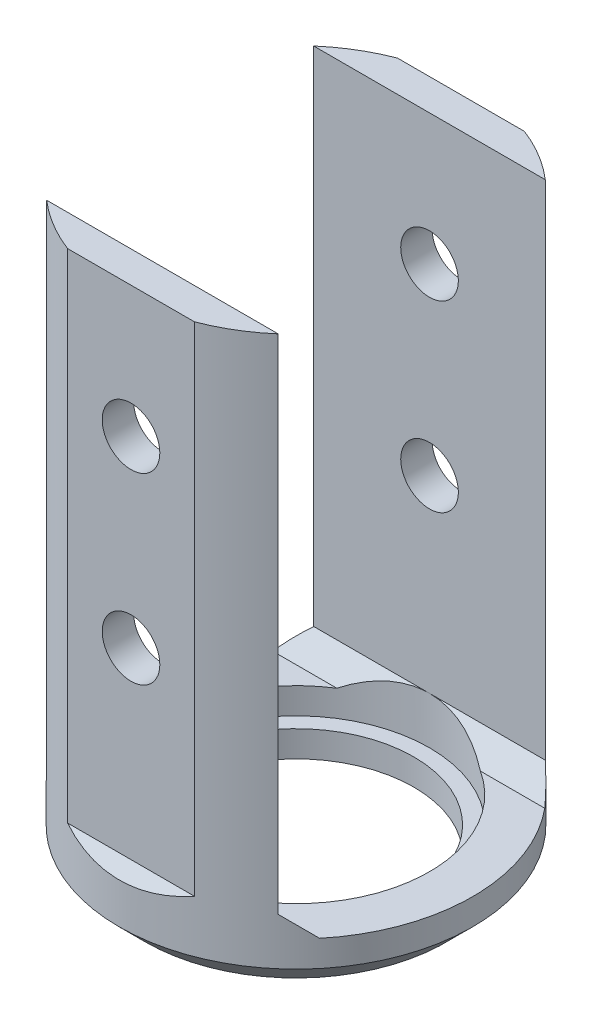
ISO-10303-21;
HEADER;
FILE_DESCRIPTION(('STEP AP214'),'2;1');
FILE_NAME('part.step','',(''),(''),'','','');
FILE_SCHEMA(('AUTOMOTIVE_DESIGN { 1 0 10303 214 1 1 1 1 }'));
ENDSEC;
DATA;
#1=APPLICATION_CONTEXT('core data for automotive mechanical design processes');
#2=APPLICATION_PROTOCOL_DEFINITION('international standard','automotive_design',2000,#1);
#3=PRODUCT_CONTEXT('',#1,'mechanical');
#4=PRODUCT('Part','Part','',(#3));
#5=PRODUCT_RELATED_PRODUCT_CATEGORY('part','',(#4));
#6=PRODUCT_DEFINITION_FORMATION('','',#4);
#7=PRODUCT_DEFINITION_CONTEXT('part definition',#1,'design');
#8=PRODUCT_DEFINITION('design','',#6,#7);
#9=PRODUCT_DEFINITION_SHAPE('','',#8);
#10=(LENGTH_UNIT() NAMED_UNIT(*) SI_UNIT(.MILLI.,.METRE.));
#11=(NAMED_UNIT(*) PLANE_ANGLE_UNIT() SI_UNIT($,.RADIAN.));
#12=(NAMED_UNIT(*) SI_UNIT($,.STERADIAN.) SOLID_ANGLE_UNIT());
#13=UNCERTAINTY_MEASURE_WITH_UNIT(LENGTH_MEASURE(1.E-05),#10,'distance_accuracy_value','');
#14=(GEOMETRIC_REPRESENTATION_CONTEXT(3) GLOBAL_UNCERTAINTY_ASSIGNED_CONTEXT((#13)) GLOBAL_UNIT_ASSIGNED_CONTEXT((#10,
#11,#12)) REPRESENTATION_CONTEXT('',''));
#15=CARTESIAN_POINT('',(0.,0.,0.));
#16=DIRECTION('',(0.,0.,1.));
#17=DIRECTION('',(1.,0.,0.));
#18=AXIS2_PLACEMENT_3D('',#15,#16,#17);
#19=CARTESIAN_POINT('',(0.,2.,0.));
#20=DIRECTION('',(0.,1.,0.));
#21=DIRECTION('',(0.,0.,1.));
#22=AXIS2_PLACEMENT_3D('',#19,#20,#21);
#23=PLANE('',#22);
#24=CARTESIAN_POINT('',(0.,2.,0.));
#25=DIRECTION('',(0.,1.,0.));
#26=DIRECTION('',(0.,0.,1.));
#27=AXIS2_PLACEMENT_3D('',#24,#25,#26);
#28=CIRCLE('',#27,5.1);
#29=CARTESIAN_POINT('',(2.74226184016044,2.,4.29999999999999));
#30=VERTEX_POINT('',#29);
#31=CARTESIAN_POINT('',(2.74226184016043,2.,-4.29999999999999));
#32=VERTEX_POINT('',#31);
#33=EDGE_CURVE('E190',#30,#32,#28,.T.);
#34=ORIENTED_EDGE('',*,*,#33,.F.);
#35=DIRECTION('',(1.,0.,0.));
#36=VECTOR('',#35,1.);
#37=CARTESIAN_POINT('',(4.4218208918951,2.,4.29999999999999));
#38=LINE('',#37,#36);
#39=CARTESIAN_POINT('',(5.20312406156149,2.,4.29999999999999));
#40=VERTEX_POINT('',#39);
#41=EDGE_CURVE('E232',#30,#40,#38,.T.);
#42=ORIENTED_EDGE('',*,*,#41,.T.);
#43=CARTESIAN_POINT('',(0.,2.,0.));
#44=DIRECTION('',(0.,1.,0.));
#45=DIRECTION('',(0.,0.,1.));
#46=AXIS2_PLACEMENT_3D('',#43,#44,#45);
#47=CIRCLE('',#46,6.75);
#48=CARTESIAN_POINT('',(5.20312406156148,2.,-4.29999999999999));
#49=VERTEX_POINT('',#48);
#50=EDGE_CURVE('E200',#40,#49,#47,.T.);
#51=ORIENTED_EDGE('',*,*,#50,.T.);
#52=DIRECTION('',(-1.,0.,0.));
#53=VECTOR('',#52,1.);
#54=CARTESIAN_POINT('',(0.,2.,-4.29999999999999));
#55=LINE('',#54,#53);
#56=EDGE_CURVE('E230',#49,#32,#55,.T.);
#57=ORIENTED_EDGE('',*,*,#56,.T.);
#58=EDGE_LOOP('',(#34,#42,#51,#57));
#59=FACE_BOUND('',#58,.T.);
#60=ADVANCED_FACE('F45',(#59),#23,.T.);
#61=CARTESIAN_POINT('',(0.,2.,0.));
#62=DIRECTION('',(0.,-1.,0.));
#63=DIRECTION('',(0.,0.,-1.));
#64=AXIS2_PLACEMENT_3D('',#61,#62,#63);
#65=CYLINDRICAL_SURFACE('',#64,4.5);
#66=CARTESIAN_POINT('',(0.,0.,0.));
#67=DIRECTION('',(0.,1.,0.));
#68=DIRECTION('',(0.,0.,1.));
#69=AXIS2_PLACEMENT_3D('',#66,#67,#68);
#70=CIRCLE('',#69,4.5);
#71=CARTESIAN_POINT('',(0.,0.,4.5));
#72=VERTEX_POINT('',#71);
#73=EDGE_CURVE('E197',#72,#72,#70,.T.);
#74=ORIENTED_EDGE('',*,*,#73,.F.);
#75=EDGE_LOOP('',(#74));
#76=FACE_BOUND('',#75,.T.);
#77=CARTESIAN_POINT('',(0.,1.,0.));
#78=DIRECTION('',(0.,1.,0.));
#79=DIRECTION('',(0.,0.,1.));
#80=AXIS2_PLACEMENT_3D('',#77,#78,#79);
#81=CIRCLE('',#80,4.5);
#82=CARTESIAN_POINT('',(0.,1.,4.5));
#83=VERTEX_POINT('',#82);
#84=EDGE_CURVE('E194',#83,#83,#81,.T.);
#85=ORIENTED_EDGE('',*,*,#84,.T.);
#86=EDGE_LOOP('',(#85));
#87=FACE_BOUND('',#86,.T.);
#88=ADVANCED_FACE('F338',(#76,#87),#65,.F.);
#89=CARTESIAN_POINT('',(-5.20312406156148,2.,-4.29999999999999));
#90=VERTEX_POINT('',#89);
#91=CARTESIAN_POINT('',(-5.20312406156149,2.,4.29999999999999));
#92=VERTEX_POINT('',#91);
#93=EDGE_CURVE('E201',#90,#92,#47,.T.);
#94=ORIENTED_EDGE('',*,*,#93,.T.);
#95=DIRECTION('',(1.,0.,0.));
#96=VECTOR('',#95,1.);
#97=CARTESIAN_POINT('',(0.,2.,4.29999999999999));
#98=LINE('',#97,#96);
#99=CARTESIAN_POINT('',(-2.74226184016044,2.,4.29999999999999));
#100=VERTEX_POINT('',#99);
#101=EDGE_CURVE('E241',#92,#100,#98,.T.);
#102=ORIENTED_EDGE('',*,*,#101,.T.);
#103=CARTESIAN_POINT('',(-2.74226184016042,2.,-4.3));
#104=VERTEX_POINT('',#103);
#105=EDGE_CURVE('E195',#104,#100,#28,.T.);
#106=ORIENTED_EDGE('',*,*,#105,.F.);
#107=DIRECTION('',(-1.,0.,0.));
#108=VECTOR('',#107,1.);
#109=CARTESIAN_POINT('',(0.,2.,-4.29999999999999));
#110=LINE('',#109,#108);
#111=EDGE_CURVE('E239',#104,#90,#110,.T.);
#112=ORIENTED_EDGE('',*,*,#111,.T.);
#113=EDGE_LOOP('',(#94,#102,#106,#112));
#114=FACE_BOUND('',#113,.T.);
#115=ADVANCED_FACE('F281',(#114),#23,.T.);
#116=CARTESIAN_POINT('',(0.,0.,0.));
#117=DIRECTION('',(0.,1.,0.));
#118=DIRECTION('',(0.,0.,1.));
#119=AXIS2_PLACEMENT_3D('',#116,#117,#118);
#120=PLANE('',#119);
#121=CARTESIAN_POINT('',(0.,0.,0.));
#122=DIRECTION('',(0.,1.,0.));
#123=DIRECTION('',(0.,0.,1.));
#124=AXIS2_PLACEMENT_3D('',#121,#122,#123);
#125=CIRCLE('',#124,5.75);
#126=CARTESIAN_POINT('',(0.,0.,5.75));
#127=VERTEX_POINT('',#126);
#128=EDGE_CURVE('E219',#127,#127,#125,.F.);
#129=ORIENTED_EDGE('',*,*,#128,.T.);
#130=EDGE_LOOP('',(#129));
#131=FACE_BOUND('',#130,.T.);
#132=ORIENTED_EDGE('',*,*,#73,.T.);
#133=EDGE_LOOP('',(#132));
#134=FACE_BOUND('',#133,.T.);
#135=ADVANCED_FACE('F347',(#131,#134),#120,.F.);
#136=CARTESIAN_POINT('',(0.,2.,0.));
#137=DIRECTION('',(0.,-1.,0.));
#138=DIRECTION('',(0.,0.,-1.));
#139=AXIS2_PLACEMENT_3D('',#136,#137,#138);
#140=CYLINDRICAL_SURFACE('',#139,6.75);
#141=CARTESIAN_POINT('',(0.,1.,0.));
#142=DIRECTION('',(0.,1.,0.));
#143=DIRECTION('',(0.,0.,1.));
#144=AXIS2_PLACEMENT_3D('',#141,#142,#143);
#145=CIRCLE('',#144,6.75);
#146=CARTESIAN_POINT('',(0.,1.,6.75));
#147=VERTEX_POINT('',#146);
#148=EDGE_CURVE('E204',#147,#147,#145,.T.);
#149=ORIENTED_EDGE('',*,*,#148,.T.);
#150=EDGE_LOOP('',(#149));
#151=FACE_BOUND('',#150,.T.);
#152=DIRECTION('',(0.,-1.,0.));
#153=VECTOR('',#152,1.);
#154=CARTESIAN_POINT('',(-2.42332416321053,22.,-6.3));
#155=LINE('',#154,#153);
#156=CARTESIAN_POINT('',(-2.42332416321053,22.,-6.3));
#157=VERTEX_POINT('',#156);
#158=CARTESIAN_POINT('',(-2.42332416321053,3.00000000000001,-6.3));
#159=VERTEX_POINT('',#158);
#160=EDGE_CURVE('E188',#157,#159,#155,.T.);
#161=ORIENTED_EDGE('',*,*,#160,.T.);
#162=CARTESIAN_POINT('',(0.,9.29999999999993,0.));
#163=DIRECTION('',(0.,0.707106781186551,-0.707106781186543));
#164=DIRECTION('',(0.,-0.707106781186544,-0.707106781186552));
#165=AXIS2_PLACEMENT_3D('',#162,#163,#164);
#166=ELLIPSE('',#165,9.54594154601834,6.75);
#167=CARTESIAN_POINT('',(2.42332416321053,3.00000000000001,-6.3));
#168=VERTEX_POINT('',#167);
#169=EDGE_CURVE('E228',#159,#168,#166,.F.);
#170=ORIENTED_EDGE('',*,*,#169,.T.);
#171=DIRECTION('',(0.,-1.,0.));
#172=VECTOR('',#171,1.);
#173=CARTESIAN_POINT('',(2.42332416321053,22.,-6.3));
#174=LINE('',#173,#172);
#175=CARTESIAN_POINT('',(2.42332416321053,22.,-6.3));
#176=VERTEX_POINT('',#175);
#177=EDGE_CURVE('E179',#176,#168,#174,.T.);
#178=ORIENTED_EDGE('',*,*,#177,.F.);
#179=CARTESIAN_POINT('',(0.,22.,0.));
#180=DIRECTION('',(0.,1.,0.));
#181=DIRECTION('',(0.,0.,1.));
#182=AXIS2_PLACEMENT_3D('',#179,#180,#181);
#183=CIRCLE('',#182,6.75);
#184=CARTESIAN_POINT('',(4.4218208918951,22.,-5.1));
#185=VERTEX_POINT('',#184);
#186=EDGE_CURVE('E177',#185,#176,#183,.T.);
#187=ORIENTED_EDGE('',*,*,#186,.F.);
#188=DIRECTION('',(0.,-1.,0.));
#189=VECTOR('',#188,1.);
#190=CARTESIAN_POINT('',(4.4218208918951,22.,-5.1));
#191=LINE('',#190,#189);
#192=CARTESIAN_POINT('',(4.4218208918951,2.80000000000001,-5.1));
#193=VERTEX_POINT('',#192);
#194=EDGE_CURVE('E182',#185,#193,#191,.T.);
#195=ORIENTED_EDGE('',*,*,#194,.T.);
#196=CARTESIAN_POINT('',(0.,-2.30000000000004,0.));
#197=DIRECTION('',(0.,-0.707106781186544,-0.707106781186551));
#198=DIRECTION('',(0.,-0.707106781186551,0.707106781186544));
#199=AXIS2_PLACEMENT_3D('',#196,#197,#198);
#200=ELLIPSE('',#199,9.54594154601844,6.75);
#201=EDGE_CURVE('E54',#193,#49,#200,.T.);
#202=ORIENTED_EDGE('',*,*,#201,.T.);
#203=ORIENTED_EDGE('',*,*,#50,.F.);
#204=CARTESIAN_POINT('',(0.,-2.29999999999993,0.));
#205=DIRECTION('',(0.,0.707106781186552,-0.707106781186543));
#206=DIRECTION('',(0.,-0.707106781186543,-0.707106781186552));
#207=AXIS2_PLACEMENT_3D('',#204,#205,#206);
#208=ELLIPSE('',#207,9.54594154601833,6.75);
#209=CARTESIAN_POINT('',(4.4218208918951,2.8,5.1));
#210=VERTEX_POINT('',#209);
#211=EDGE_CURVE('E248',#40,#210,#208,.F.);
#212=ORIENTED_EDGE('',*,*,#211,.T.);
#213=DIRECTION('',(0.,-1.,0.));
#214=VECTOR('',#213,1.);
#215=CARTESIAN_POINT('',(4.4218208918951,22.,5.1));
#216=LINE('',#215,#214);
#217=CARTESIAN_POINT('',(4.4218208918951,22.,5.1));
#218=VERTEX_POINT('',#217);
#219=EDGE_CURVE('E171',#218,#210,#216,.T.);
#220=ORIENTED_EDGE('',*,*,#219,.F.);
#221=CARTESIAN_POINT('',(0.,22.,0.));
#222=DIRECTION('',(0.,1.,0.));
#223=DIRECTION('',(0.,0.,1.));
#224=AXIS2_PLACEMENT_3D('',#221,#222,#223);
#225=CIRCLE('',#224,6.75);
#226=CARTESIAN_POINT('',(2.42332416321053,22.,6.3));
#227=VERTEX_POINT('',#226);
#228=EDGE_CURVE('E151',#227,#218,#225,.T.);
#229=ORIENTED_EDGE('',*,*,#228,.F.);
#230=DIRECTION('',(0.,-1.,0.));
#231=VECTOR('',#230,1.);
#232=CARTESIAN_POINT('',(2.42332416321053,22.,6.3));
#233=LINE('',#232,#231);
#234=CARTESIAN_POINT('',(2.42332416321053,3.00000000000002,6.3));
#235=VERTEX_POINT('',#234);
#236=EDGE_CURVE('E148',#227,#235,#233,.T.);
#237=ORIENTED_EDGE('',*,*,#236,.T.);
#238=CARTESIAN_POINT('',(0.,9.30000000000008,0.));
#239=DIRECTION('',(0.,-0.707106781186544,-0.707106781186551));
#240=DIRECTION('',(0.,-0.707106781186551,0.707106781186544));
#241=AXIS2_PLACEMENT_3D('',#238,#239,#240);
#242=ELLIPSE('',#241,9.54594154601844,6.75);
#243=CARTESIAN_POINT('',(-2.42332416321053,3.00000000000002,6.3));
#244=VERTEX_POINT('',#243);
#245=EDGE_CURVE('E165',#235,#244,#242,.T.);
#246=ORIENTED_EDGE('',*,*,#245,.T.);
#247=DIRECTION('',(0.,-1.,0.));
#248=VECTOR('',#247,1.);
#249=CARTESIAN_POINT('',(-2.42332416321053,22.,6.3));
#250=LINE('',#249,#248);
#251=CARTESIAN_POINT('',(-2.42332416321053,22.,6.3));
#252=VERTEX_POINT('',#251);
#253=EDGE_CURVE('E145',#252,#244,#250,.T.);
#254=ORIENTED_EDGE('',*,*,#253,.F.);
#255=CARTESIAN_POINT('',(-4.4218208918951,22.,5.1));
#256=VERTEX_POINT('',#255);
#257=EDGE_CURVE('E152',#256,#252,#225,.T.);
#258=ORIENTED_EDGE('',*,*,#257,.F.);
#259=DIRECTION('',(0.,-1.,0.));
#260=VECTOR('',#259,1.);
#261=CARTESIAN_POINT('',(-4.4218208918951,22.,5.1));
#262=LINE('',#261,#260);
#263=CARTESIAN_POINT('',(-4.4218208918951,2.8,5.1));
#264=VERTEX_POINT('',#263);
#265=EDGE_CURVE('E296',#256,#264,#262,.T.);
#266=ORIENTED_EDGE('',*,*,#265,.T.);
#267=CARTESIAN_POINT('',(0.,-2.29999999999993,0.));
#268=DIRECTION('',(0.,0.707106781186552,-0.707106781186543));
#269=DIRECTION('',(0.,-0.707106781186543,-0.707106781186552));
#270=AXIS2_PLACEMENT_3D('',#267,#268,#269);
#271=ELLIPSE('',#270,9.54594154601833,6.75);
#272=EDGE_CURVE('E253',#264,#92,#271,.F.);
#273=ORIENTED_EDGE('',*,*,#272,.T.);
#274=ORIENTED_EDGE('',*,*,#93,.F.);
#275=CARTESIAN_POINT('',(0.,-2.30000000000004,0.));
#276=DIRECTION('',(0.,-0.707106781186544,-0.707106781186551));
#277=DIRECTION('',(0.,-0.707106781186551,0.707106781186544));
#278=AXIS2_PLACEMENT_3D('',#275,#276,#277);
#279=ELLIPSE('',#278,9.54594154601844,6.75);
#280=CARTESIAN_POINT('',(-4.4218208918951,2.80000000000001,-5.1));
#281=VERTEX_POINT('',#280);
#282=EDGE_CURVE('E257',#90,#281,#279,.T.);
#283=ORIENTED_EDGE('',*,*,#282,.T.);
#284=DIRECTION('',(0.,-1.,0.));
#285=VECTOR('',#284,1.);
#286=CARTESIAN_POINT('',(-4.4218208918951,22.,-5.1));
#287=LINE('',#286,#285);
#288=CARTESIAN_POINT('',(-4.4218208918951,22.,-5.1));
#289=VERTEX_POINT('',#288);
#290=EDGE_CURVE('E185',#289,#281,#287,.T.);
#291=ORIENTED_EDGE('',*,*,#290,.F.);
#292=EDGE_CURVE('E169',#157,#289,#183,.T.);
#293=ORIENTED_EDGE('',*,*,#292,.F.);
#294=EDGE_LOOP('',(#161,#170,#178,#187,#195,#202,#203,#212,#220,#229,#237,#246,#254,#258,#266,
#273,#274,#283,#291,#293));
#295=FACE_BOUND('',#294,.T.);
#296=ADVANCED_FACE('F164',(#151,#295),#140,.T.);
#297=CARTESIAN_POINT('',(0.,1.,0.));
#298=DIRECTION('',(0.,1.,0.));
#299=DIRECTION('',(0.,0.,1.));
#300=AXIS2_PLACEMENT_3D('',#297,#298,#299);
#301=CYLINDRICAL_SURFACE('',#300,5.1);
#302=CARTESIAN_POINT('',(0.,1.,0.));
#303=DIRECTION('',(0.,1.,0.));
#304=DIRECTION('',(0.,0.,1.));
#305=AXIS2_PLACEMENT_3D('',#302,#303,#304);
#306=CIRCLE('',#305,5.1);
#307=CARTESIAN_POINT('',(0.,1.,5.1));
#308=VERTEX_POINT('',#307);
#309=EDGE_CURVE('E191',#308,#308,#306,.T.);
#310=ORIENTED_EDGE('',*,*,#309,.F.);
#311=EDGE_LOOP('',(#310));
#312=FACE_BOUND('',#311,.T.);
#313=ORIENTED_EDGE('',*,*,#33,.T.);
#314=CARTESIAN_POINT('',(0.,-2.30000000000004,0.));
#315=DIRECTION('',(0.,-0.707106781186544,-0.707106781186551));
#316=DIRECTION('',(0.,0.707106781186551,-0.707106781186544));
#317=AXIS2_PLACEMENT_3D('',#314,#315,#316);
#318=ELLIPSE('',#317,7.21248916810282,5.1);
#319=CARTESIAN_POINT('',(0.,2.80000000000001,-5.1));
#320=VERTEX_POINT('',#319);
#321=EDGE_CURVE('E11',#32,#320,#318,.F.);
#322=ORIENTED_EDGE('',*,*,#321,.T.);
#323=CARTESIAN_POINT('',(0.,-2.30000000000004,0.));
#324=DIRECTION('',(0.,-0.707106781186544,-0.707106781186551));
#325=DIRECTION('',(0.,0.707106781186551,-0.707106781186544));
#326=AXIS2_PLACEMENT_3D('',#323,#324,#325);
#327=ELLIPSE('',#326,7.21248916810282,5.1);
#328=EDGE_CURVE('E255',#320,#104,#327,.F.);
#329=ORIENTED_EDGE('',*,*,#328,.T.);
#330=ORIENTED_EDGE('',*,*,#105,.T.);
#331=CARTESIAN_POINT('',(0.,-2.29999999999993,0.));
#332=DIRECTION('',(0.,0.707106781186552,-0.707106781186543));
#333=DIRECTION('',(0.,0.707106781186543,0.707106781186552));
#334=AXIS2_PLACEMENT_3D('',#331,#332,#333);
#335=ELLIPSE('',#334,7.21248916810274,5.1);
#336=CARTESIAN_POINT('',(0.,2.8,5.1));
#337=VERTEX_POINT('',#336);
#338=EDGE_CURVE('E66',#100,#337,#335,.T.);
#339=ORIENTED_EDGE('',*,*,#338,.T.);
#340=CARTESIAN_POINT('',(0.,-2.29999999999993,0.));
#341=DIRECTION('',(0.,0.707106781186552,-0.707106781186543));
#342=DIRECTION('',(0.,0.707106781186543,0.707106781186552));
#343=AXIS2_PLACEMENT_3D('',#340,#341,#342);
#344=ELLIPSE('',#343,7.21248916810274,5.1);
#345=EDGE_CURVE('E250',#337,#30,#344,.T.);
#346=ORIENTED_EDGE('',*,*,#345,.T.);
#347=EDGE_LOOP('',(#313,#322,#329,#330,#339,#346));
#348=FACE_BOUND('',#347,.T.);
#349=ADVANCED_FACE('F279',(#312,#348),#301,.F.);
#350=CARTESIAN_POINT('',(0.,1.,0.));
#351=DIRECTION('',(0.,1.,0.));
#352=DIRECTION('',(0.,0.,1.));
#353=AXIS2_PLACEMENT_3D('',#350,#351,#352);
#354=PLANE('',#353);
#355=ORIENTED_EDGE('',*,*,#84,.F.);
#356=EDGE_LOOP('',(#355));
#357=FACE_BOUND('',#356,.T.);
#358=ORIENTED_EDGE('',*,*,#309,.T.);
#359=EDGE_LOOP('',(#358));
#360=FACE_BOUND('',#359,.T.);
#361=ADVANCED_FACE('F468',(#357,#360),#354,.T.);
#362=CARTESIAN_POINT('',(0.,22.,-6.3));
#363=DIRECTION('',(0.,0.,-1.));
#364=DIRECTION('',(-1.,0.,0.));
#365=AXIS2_PLACEMENT_3D('',#362,#363,#364);
#366=PLANE('',#365);
#367=CARTESIAN_POINT('',(0.,17.,-6.3));
#368=DIRECTION('',(0.,0.,-1.));
#369=DIRECTION('',(-1.,0.,0.));
#370=AXIS2_PLACEMENT_3D('',#367,#368,#369);
#371=CIRCLE('',#370,1.1);
#372=CARTESIAN_POINT('',(-1.1,17.,-6.3));
#373=VERTEX_POINT('',#372);
#374=EDGE_CURVE('E161',#373,#373,#371,.T.);
#375=ORIENTED_EDGE('',*,*,#374,.F.);
#376=EDGE_LOOP('',(#375));
#377=FACE_BOUND('',#376,.T.);
#378=CARTESIAN_POINT('',(0.,10.,-6.3));
#379=DIRECTION('',(0.,0.,-1.));
#380=DIRECTION('',(-1.,0.,0.));
#381=AXIS2_PLACEMENT_3D('',#378,#379,#380);
#382=CIRCLE('',#381,1.1);
#383=CARTESIAN_POINT('',(-1.1,10.,-6.3));
#384=VERTEX_POINT('',#383);
#385=EDGE_CURVE('E216',#384,#384,#382,.T.);
#386=ORIENTED_EDGE('',*,*,#385,.F.);
#387=EDGE_LOOP('',(#386));
#388=FACE_BOUND('',#387,.T.);
#389=ORIENTED_EDGE('',*,*,#177,.T.);
#390=DIRECTION('',(-1.,0.,0.));
#391=VECTOR('',#390,1.);
#392=CARTESIAN_POINT('',(-2.42332416321053,3.00000000000001,-6.3));
#393=LINE('',#392,#391);
#394=EDGE_CURVE('E224',#168,#159,#393,.T.);
#395=ORIENTED_EDGE('',*,*,#394,.T.);
#396=ORIENTED_EDGE('',*,*,#160,.F.);
#397=DIRECTION('',(1.,0.,0.));
#398=VECTOR('',#397,1.);
#399=CARTESIAN_POINT('',(0.,22.,-6.3));
#400=LINE('',#399,#398);
#401=EDGE_CURVE('E166',#157,#176,#400,.T.);
#402=ORIENTED_EDGE('',*,*,#401,.T.);
#403=EDGE_LOOP('',(#389,#395,#396,#402));
#404=FACE_BOUND('',#403,.T.);
#405=ADVANCED_FACE('F473',(#377,#388,#404),#366,.T.);
#406=CARTESIAN_POINT('',(0.,22.,-5.1));
#407=DIRECTION('',(0.,0.,-1.));
#408=DIRECTION('',(-1.,0.,0.));
#409=AXIS2_PLACEMENT_3D('',#406,#407,#408);
#410=PLANE('',#409);
#411=CARTESIAN_POINT('',(0.,17.,-5.1));
#412=DIRECTION('',(0.,0.,-1.));
#413=DIRECTION('',(-1.,0.,0.));
#414=AXIS2_PLACEMENT_3D('',#411,#412,#413);
#415=CIRCLE('',#414,1.1);
#416=CARTESIAN_POINT('',(-1.1,17.,-5.1));
#417=VERTEX_POINT('',#416);
#418=EDGE_CURVE('E215',#417,#417,#415,.T.);
#419=ORIENTED_EDGE('',*,*,#418,.T.);
#420=EDGE_LOOP('',(#419));
#421=FACE_BOUND('',#420,.T.);
#422=CARTESIAN_POINT('',(0.,10.,-5.1));
#423=DIRECTION('',(0.,0.,-1.));
#424=DIRECTION('',(-1.,0.,0.));
#425=AXIS2_PLACEMENT_3D('',#422,#423,#424);
#426=CIRCLE('',#425,1.1);
#427=CARTESIAN_POINT('',(-1.1,10.,-5.1));
#428=VERTEX_POINT('',#427);
#429=EDGE_CURVE('E210',#428,#428,#426,.T.);
#430=ORIENTED_EDGE('',*,*,#429,.T.);
#431=EDGE_LOOP('',(#430));
#432=FACE_BOUND('',#431,.T.);
#433=ORIENTED_EDGE('',*,*,#290,.T.);
#434=DIRECTION('',(1.,0.,0.));
#435=VECTOR('',#434,1.);
#436=CARTESIAN_POINT('',(0.,2.80000000000001,-5.1));
#437=LINE('',#436,#435);
#438=EDGE_CURVE('E245',#281,#320,#437,.T.);
#439=ORIENTED_EDGE('',*,*,#438,.T.);
#440=DIRECTION('',(1.,0.,0.));
#441=VECTOR('',#440,1.);
#442=CARTESIAN_POINT('',(0.,2.80000000000001,-5.1));
#443=LINE('',#442,#441);
#444=EDGE_CURVE('E243',#320,#193,#443,.T.);
#445=ORIENTED_EDGE('',*,*,#444,.T.);
#446=ORIENTED_EDGE('',*,*,#194,.F.);
#447=DIRECTION('',(1.,0.,0.));
#448=VECTOR('',#447,1.);
#449=CARTESIAN_POINT('',(0.,22.,-5.1));
#450=LINE('',#449,#448);
#451=EDGE_CURVE('E176',#289,#185,#450,.T.);
#452=ORIENTED_EDGE('',*,*,#451,.F.);
#453=EDGE_LOOP('',(#433,#439,#445,#446,#452));
#454=FACE_BOUND('',#453,.T.);
#455=ADVANCED_FACE('F271',(#421,#432,#454),#410,.F.);
#456=CARTESIAN_POINT('',(0.,22.,0.));
#457=DIRECTION('',(0.,1.,0.));
#458=DIRECTION('',(0.,0.,1.));
#459=AXIS2_PLACEMENT_3D('',#456,#457,#458);
#460=PLANE('',#459);
#461=ORIENTED_EDGE('',*,*,#401,.F.);
#462=ORIENTED_EDGE('',*,*,#292,.T.);
#463=ORIENTED_EDGE('',*,*,#451,.T.);
#464=ORIENTED_EDGE('',*,*,#186,.T.);
#465=EDGE_LOOP('',(#461,#462,#463,#464));
#466=FACE_BOUND('',#465,.T.);
#467=ADVANCED_FACE('F318',(#466),#460,.T.);
#468=CARTESIAN_POINT('',(0.,22.,6.3));
#469=DIRECTION('',(0.,0.,-1.));
#470=DIRECTION('',(-1.,0.,0.));
#471=AXIS2_PLACEMENT_3D('',#468,#469,#470);
#472=PLANE('',#471);
#473=CARTESIAN_POINT('',(0.,17.,6.3));
#474=DIRECTION('',(0.,0.,1.));
#475=DIRECTION('',(1.,0.,0.));
#476=AXIS2_PLACEMENT_3D('',#473,#474,#475);
#477=CIRCLE('',#476,1.1);
#478=CARTESIAN_POINT('',(1.1,17.,6.3));
#479=VERTEX_POINT('',#478);
#480=EDGE_CURVE('E211',#479,#479,#477,.T.);
#481=ORIENTED_EDGE('',*,*,#480,.F.);
#482=EDGE_LOOP('',(#481));
#483=FACE_BOUND('',#482,.T.);
#484=CARTESIAN_POINT('',(0.,10.,6.3));
#485=DIRECTION('',(0.,0.,1.));
#486=DIRECTION('',(1.,0.,0.));
#487=AXIS2_PLACEMENT_3D('',#484,#485,#486);
#488=CIRCLE('',#487,1.1);
#489=CARTESIAN_POINT('',(1.1,10.,6.3));
#490=VERTEX_POINT('',#489);
#491=EDGE_CURVE('E308',#490,#490,#488,.T.);
#492=ORIENTED_EDGE('',*,*,#491,.F.);
#493=EDGE_LOOP('',(#492));
#494=FACE_BOUND('',#493,.T.);
#495=ORIENTED_EDGE('',*,*,#253,.T.);
#496=DIRECTION('',(1.,0.,0.));
#497=VECTOR('',#496,1.);
#498=CARTESIAN_POINT('',(0.,3.00000000000002,6.3));
#499=LINE('',#498,#497);
#500=EDGE_CURVE('E222',#244,#235,#499,.T.);
#501=ORIENTED_EDGE('',*,*,#500,.T.);
#502=ORIENTED_EDGE('',*,*,#236,.F.);
#503=DIRECTION('',(1.,0.,0.));
#504=VECTOR('',#503,1.);
#505=CARTESIAN_POINT('',(0.,22.,6.3));
#506=LINE('',#505,#504);
#507=EDGE_CURVE('E140',#252,#227,#506,.T.);
#508=ORIENTED_EDGE('',*,*,#507,.F.);
#509=EDGE_LOOP('',(#495,#501,#502,#508));
#510=FACE_BOUND('',#509,.T.);
#511=ADVANCED_FACE('F142',(#483,#494,#510),#472,.F.);
#512=CARTESIAN_POINT('',(0.,22.,5.1));
#513=DIRECTION('',(0.,0.,-1.));
#514=DIRECTION('',(-1.,0.,0.));
#515=AXIS2_PLACEMENT_3D('',#512,#513,#514);
#516=PLANE('',#515);
#517=CARTESIAN_POINT('',(0.,17.,5.1));
#518=DIRECTION('',(0.,0.,-1.));
#519=DIRECTION('',(-1.,0.,0.));
#520=AXIS2_PLACEMENT_3D('',#517,#518,#519);
#521=CIRCLE('',#520,1.1);
#522=CARTESIAN_POINT('',(-1.1,17.,5.1));
#523=VERTEX_POINT('',#522);
#524=EDGE_CURVE('E212',#523,#523,#521,.T.);
#525=ORIENTED_EDGE('',*,*,#524,.F.);
#526=EDGE_LOOP('',(#525));
#527=FACE_BOUND('',#526,.T.);
#528=CARTESIAN_POINT('',(0.,10.,5.1));
#529=DIRECTION('',(0.,0.,-1.));
#530=DIRECTION('',(-1.,0.,0.));
#531=AXIS2_PLACEMENT_3D('',#528,#529,#530);
#532=CIRCLE('',#531,1.1);
#533=CARTESIAN_POINT('',(-1.1,10.,5.1));
#534=VERTEX_POINT('',#533);
#535=EDGE_CURVE('E207',#534,#534,#532,.T.);
#536=ORIENTED_EDGE('',*,*,#535,.F.);
#537=EDGE_LOOP('',(#536));
#538=FACE_BOUND('',#537,.T.);
#539=ORIENTED_EDGE('',*,*,#219,.T.);
#540=DIRECTION('',(-1.,0.,0.));
#541=VECTOR('',#540,1.);
#542=CARTESIAN_POINT('',(0.,2.8,5.1));
#543=LINE('',#542,#541);
#544=EDGE_CURVE('E237',#210,#337,#543,.T.);
#545=ORIENTED_EDGE('',*,*,#544,.T.);
#546=DIRECTION('',(-1.,0.,0.));
#547=VECTOR('',#546,1.);
#548=CARTESIAN_POINT('',(-4.4218208918951,2.8,5.1));
#549=LINE('',#548,#547);
#550=EDGE_CURVE('E235',#337,#264,#549,.T.);
#551=ORIENTED_EDGE('',*,*,#550,.T.);
#552=ORIENTED_EDGE('',*,*,#265,.F.);
#553=DIRECTION('',(1.,0.,0.));
#554=VECTOR('',#553,1.);
#555=CARTESIAN_POINT('',(0.,22.,5.1));
#556=LINE('',#555,#554);
#557=EDGE_CURVE('E158',#256,#218,#556,.T.);
#558=ORIENTED_EDGE('',*,*,#557,.T.);
#559=EDGE_LOOP('',(#539,#545,#551,#552,#558));
#560=FACE_BOUND('',#559,.T.);
#561=ADVANCED_FACE('F295',(#527,#538,#560),#516,.T.);
#562=CARTESIAN_POINT('',(0.,22.,0.));
#563=DIRECTION('',(0.,1.,0.));
#564=DIRECTION('',(0.,0.,1.));
#565=AXIS2_PLACEMENT_3D('',#562,#563,#564);
#566=PLANE('',#565);
#567=ORIENTED_EDGE('',*,*,#257,.T.);
#568=ORIENTED_EDGE('',*,*,#507,.T.);
#569=ORIENTED_EDGE('',*,*,#228,.T.);
#570=ORIENTED_EDGE('',*,*,#557,.F.);
#571=EDGE_LOOP('',(#567,#568,#569,#570));
#572=FACE_BOUND('',#571,.T.);
#573=ADVANCED_FACE('F156',(#572),#566,.T.);
#574=CARTESIAN_POINT('',(0.,10.,-13.7));
#575=DIRECTION('',(0.,0.,1.));
#576=DIRECTION('',(1.,0.,0.));
#577=AXIS2_PLACEMENT_3D('',#574,#575,#576);
#578=CYLINDRICAL_SURFACE('',#577,1.1);
#579=ORIENTED_EDGE('',*,*,#535,.T.);
#580=EDGE_LOOP('',(#579));
#581=FACE_BOUND('',#580,.T.);
#582=ORIENTED_EDGE('',*,*,#491,.T.);
#583=EDGE_LOOP('',(#582));
#584=FACE_BOUND('',#583,.T.);
#585=ADVANCED_FACE('F322',(#581,#584),#578,.F.);
#586=CARTESIAN_POINT('',(0.,17.,-13.7));
#587=DIRECTION('',(0.,0.,1.));
#588=DIRECTION('',(1.,0.,0.));
#589=AXIS2_PLACEMENT_3D('',#586,#587,#588);
#590=CYLINDRICAL_SURFACE('',#589,1.1);
#591=ORIENTED_EDGE('',*,*,#524,.T.);
#592=EDGE_LOOP('',(#591));
#593=FACE_BOUND('',#592,.T.);
#594=ORIENTED_EDGE('',*,*,#480,.T.);
#595=EDGE_LOOP('',(#594));
#596=FACE_BOUND('',#595,.T.);
#597=ADVANCED_FACE('F314',(#593,#596),#590,.F.);
#598=ORIENTED_EDGE('',*,*,#385,.T.);
#599=EDGE_LOOP('',(#598));
#600=FACE_BOUND('',#599,.T.);
#601=ORIENTED_EDGE('',*,*,#429,.F.);
#602=EDGE_LOOP('',(#601));
#603=FACE_BOUND('',#602,.T.);
#604=ADVANCED_FACE('F326',(#600,#603),#578,.F.);
#605=ORIENTED_EDGE('',*,*,#374,.T.);
#606=EDGE_LOOP('',(#605));
#607=FACE_BOUND('',#606,.T.);
#608=ORIENTED_EDGE('',*,*,#418,.F.);
#609=EDGE_LOOP('',(#608));
#610=FACE_BOUND('',#609,.T.);
#611=ADVANCED_FACE('F333',(#607,#610),#590,.F.);
#612=CARTESIAN_POINT('',(0.,1.,0.));
#613=DIRECTION('',(0.,1.,0.));
#614=DIRECTION('',(0.,0.,1.));
#615=AXIS2_PLACEMENT_3D('',#612,#613,#614);
#616=CONICAL_SURFACE('',#615,6.75,0.785398163397449);
#617=ORIENTED_EDGE('',*,*,#128,.F.);
#618=EDGE_LOOP('',(#617));
#619=FACE_BOUND('',#618,.T.);
#620=ORIENTED_EDGE('',*,*,#148,.F.);
#621=EDGE_LOOP('',(#620));
#622=FACE_BOUND('',#621,.T.);
#623=ADVANCED_FACE('F360',(#619,#622),#616,.T.);
#624=CARTESIAN_POINT('',(0.,3.00000000000002,6.3));
#625=DIRECTION('',(0.,-0.707106781186544,-0.707106781186551));
#626=DIRECTION('',(1.,0.,0.));
#627=AXIS2_PLACEMENT_3D('',#624,#625,#626);
#628=PLANE('',#627);
#629=ORIENTED_EDGE('',*,*,#500,.F.);
#630=ORIENTED_EDGE('',*,*,#245,.F.);
#631=EDGE_LOOP('',(#629,#630));
#632=FACE_BOUND('',#631,.T.);
#633=ADVANCED_FACE('F366',(#632),#628,.F.);
#634=CARTESIAN_POINT('',(0.,2.,-7.30000000000002));
#635=DIRECTION('',(0.,0.707106781186551,-0.707106781186543));
#636=DIRECTION('',(-1.,0.,0.));
#637=AXIS2_PLACEMENT_3D('',#634,#635,#636);
#638=PLANE('',#637);
#639=ORIENTED_EDGE('',*,*,#169,.F.);
#640=ORIENTED_EDGE('',*,*,#394,.F.);
#641=EDGE_LOOP('',(#639,#640));
#642=FACE_BOUND('',#641,.T.);
#643=ADVANCED_FACE('F373',(#642),#638,.T.);
#644=CARTESIAN_POINT('',(0.,2.,4.29999999999999));
#645=DIRECTION('',(0.,0.707106781186552,-0.707106781186543));
#646=DIRECTION('',(-1.,0.,0.));
#647=AXIS2_PLACEMENT_3D('',#644,#645,#646);
#648=PLANE('',#647);
#649=ORIENTED_EDGE('',*,*,#272,.F.);
#650=ORIENTED_EDGE('',*,*,#550,.F.);
#651=ORIENTED_EDGE('',*,*,#338,.F.);
#652=ORIENTED_EDGE('',*,*,#101,.F.);
#653=EDGE_LOOP('',(#649,#650,#651,#652));
#654=FACE_BOUND('',#653,.T.);
#655=ADVANCED_FACE('F286',(#654),#648,.T.);
#656=CARTESIAN_POINT('',(0.,2.,4.29999999999999));
#657=DIRECTION('',(0.,0.707106781186552,-0.707106781186543));
#658=DIRECTION('',(-1.,0.,0.));
#659=AXIS2_PLACEMENT_3D('',#656,#657,#658);
#660=PLANE('',#659);
#661=ORIENTED_EDGE('',*,*,#345,.F.);
#662=ORIENTED_EDGE('',*,*,#544,.F.);
#663=ORIENTED_EDGE('',*,*,#211,.F.);
#664=ORIENTED_EDGE('',*,*,#41,.F.);
#665=EDGE_LOOP('',(#661,#662,#663,#664));
#666=FACE_BOUND('',#665,.T.);
#667=ADVANCED_FACE('F292',(#666),#660,.T.);
#668=CARTESIAN_POINT('',(0.,2.80000000000001,-5.1));
#669=DIRECTION('',(0.,-0.707106781186544,-0.707106781186551));
#670=DIRECTION('',(1.,0.,0.));
#671=AXIS2_PLACEMENT_3D('',#668,#669,#670);
#672=PLANE('',#671);
#673=ORIENTED_EDGE('',*,*,#201,.F.);
#674=ORIENTED_EDGE('',*,*,#444,.F.);
#675=ORIENTED_EDGE('',*,*,#321,.F.);
#676=ORIENTED_EDGE('',*,*,#56,.F.);
#677=EDGE_LOOP('',(#673,#674,#675,#676));
#678=FACE_BOUND('',#677,.T.);
#679=ADVANCED_FACE('F48',(#678),#672,.F.);
#680=CARTESIAN_POINT('',(0.,2.80000000000001,-5.1));
#681=DIRECTION('',(0.,-0.707106781186544,-0.707106781186551));
#682=DIRECTION('',(1.,0.,0.));
#683=AXIS2_PLACEMENT_3D('',#680,#681,#682);
#684=PLANE('',#683);
#685=ORIENTED_EDGE('',*,*,#282,.F.);
#686=ORIENTED_EDGE('',*,*,#111,.F.);
#687=ORIENTED_EDGE('',*,*,#328,.F.);
#688=ORIENTED_EDGE('',*,*,#438,.F.);
#689=EDGE_LOOP('',(#685,#686,#687,#688));
#690=FACE_BOUND('',#689,.T.);
#691=ADVANCED_FACE('F276',(#690),#684,.F.);
#692=CLOSED_SHELL('',(#60,#88,#115,#135,#296,#349,#361,#405,#455,#467,#511,#561,#573,#585,#597,
#604,#611,#623,#633,#643,#655,#667,#679,#691));
#693=MANIFOLD_SOLID_BREP('B2',#692);
#694=ADVANCED_BREP_SHAPE_REPRESENTATION('',(#18,#693),#14);
#695=SHAPE_DEFINITION_REPRESENTATION(#9,#694);
ENDSEC;
END-ISO-10303-21;
